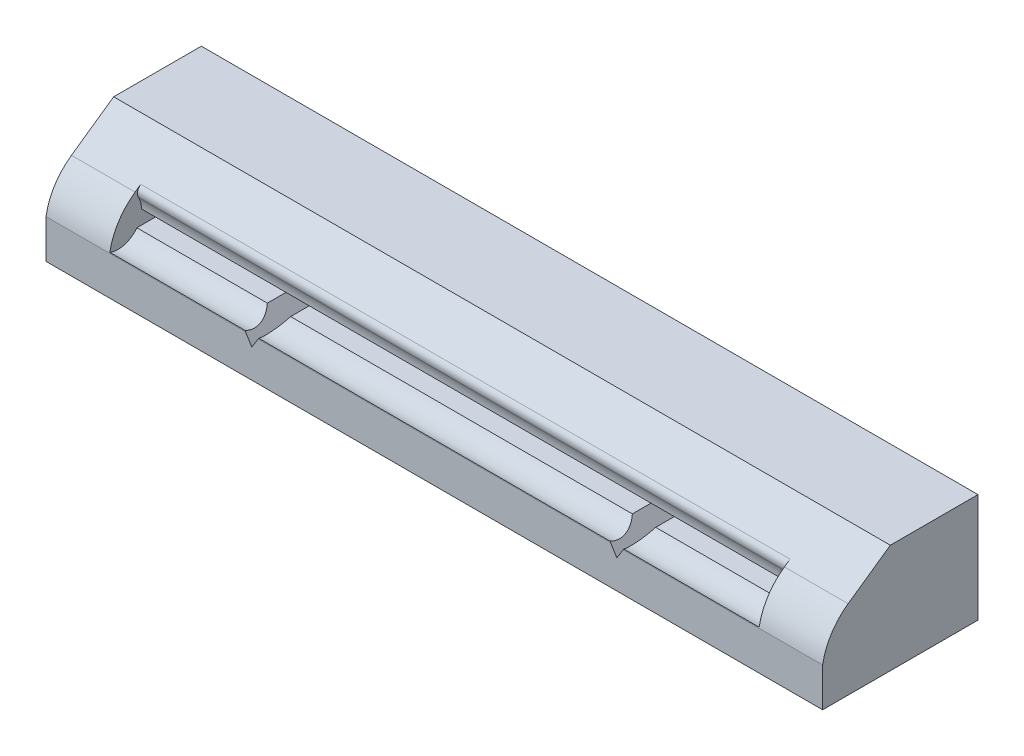
ISO-10303-21;
HEADER;
FILE_DESCRIPTION(('STEP AP214'),'2;1');
FILE_NAME('part.step','',(''),(''),'','','');
FILE_SCHEMA(('AUTOMOTIVE_DESIGN { 1 0 10303 214 1 1 1 1 }'));
ENDSEC;
DATA;
#1=APPLICATION_CONTEXT('core data for automotive mechanical design processes');
#2=APPLICATION_PROTOCOL_DEFINITION('international standard','automotive_design',2000,#1);
#3=PRODUCT_CONTEXT('',#1,'mechanical');
#4=PRODUCT('Part','Part','',(#3));
#5=PRODUCT_RELATED_PRODUCT_CATEGORY('part','',(#4));
#6=PRODUCT_DEFINITION_FORMATION('','',#4);
#7=PRODUCT_DEFINITION_CONTEXT('part definition',#1,'design');
#8=PRODUCT_DEFINITION('design','',#6,#7);
#9=PRODUCT_DEFINITION_SHAPE('','',#8);
#10=(LENGTH_UNIT() NAMED_UNIT(*) SI_UNIT(.MILLI.,.METRE.));
#11=(NAMED_UNIT(*) PLANE_ANGLE_UNIT() SI_UNIT($,.RADIAN.));
#12=(NAMED_UNIT(*) SI_UNIT($,.STERADIAN.) SOLID_ANGLE_UNIT());
#13=UNCERTAINTY_MEASURE_WITH_UNIT(LENGTH_MEASURE(1.E-05),#10,'distance_accuracy_value','');
#14=(GEOMETRIC_REPRESENTATION_CONTEXT(3) GLOBAL_UNCERTAINTY_ASSIGNED_CONTEXT((#13)) GLOBAL_UNIT_ASSIGNED_CONTEXT((#10,
#11,#12)) REPRESENTATION_CONTEXT('',''));
#15=CARTESIAN_POINT('',(0.,0.,0.));
#16=DIRECTION('',(0.,0.,1.));
#17=DIRECTION('',(1.,0.,0.));
#18=AXIS2_PLACEMENT_3D('',#15,#16,#17);
#19=CARTESIAN_POINT('',(-25.,-1.6543103448275,6.08499685629618));
#20=DIRECTION('',(1.,0.,0.));
#21=DIRECTION('',(0.,0.,-1.));
#22=AXIS2_PLACEMENT_3D('',#19,#20,#21);
#23=CYLINDRICAL_SURFACE('',#22,3.96930367225274);
#24=CARTESIAN_POINT('',(-20.9,-1.6543103448275,6.08499685629618));
#25=DIRECTION('',(-1.,0.,0.));
#26=DIRECTION('',(0.,-1.,0.));
#27=AXIS2_PLACEMENT_3D('',#24,#25,#26);
#28=CIRCLE('',#27,3.96930367225274);
#29=CARTESIAN_POINT('',(-20.9,1.59715287270214,8.36169591142201));
#30=VERTEX_POINT('',#29);
#31=CARTESIAN_POINT('',(-20.9,-0.949205843987241,9.9911713641048));
#32=VERTEX_POINT('',#31);
#33=EDGE_CURVE('E49',#30,#32,#28,.F.);
#34=ORIENTED_EDGE('',*,*,#33,.F.);
#35=DIRECTION('',(1.,0.,0.));
#36=VECTOR('',#35,1.);
#37=CARTESIAN_POINT('',(-25.,1.59715287270214,8.36169591142201));
#38=LINE('',#37,#36);
#39=CARTESIAN_POINT('',(-25.,1.59715287270214,8.36169591142201));
#40=VERTEX_POINT('',#39);
#41=EDGE_CURVE('E292',#40,#30,#38,.T.);
#42=ORIENTED_EDGE('',*,*,#41,.F.);
#43=CARTESIAN_POINT('',(-25.,-1.6543103448275,6.08499685629618));
#44=DIRECTION('',(-1.,0.,0.));
#45=DIRECTION('',(0.,0.,1.));
#46=AXIS2_PLACEMENT_3D('',#43,#44,#45);
#47=CIRCLE('',#46,3.96930367225274);
#48=CARTESIAN_POINT('',(-25.,-1.,10.));
#49=VERTEX_POINT('',#48);
#50=EDGE_CURVE('E277',#49,#40,#47,.T.);
#51=ORIENTED_EDGE('',*,*,#50,.F.);
#52=DIRECTION('',(1.,0.,0.));
#53=VECTOR('',#52,1.);
#54=CARTESIAN_POINT('',(-25.,-1.,10.));
#55=LINE('',#54,#53);
#56=CARTESIAN_POINT('',(-12.15625,-1.,10.));
#57=VERTEX_POINT('',#56);
#58=EDGE_CURVE('E284',#49,#57,#55,.T.);
#59=ORIENTED_EDGE('',*,*,#58,.T.);
#60=CARTESIAN_POINT('',(-11.7473060344828,-1.6543103448275,6.08499685629618));
#61=DIRECTION('',(-0.847998304005088,-0.52999894000318,0.));
#62=DIRECTION('',(0.52999894000318,-0.847998304005088,0.));
#63=AXIS2_PLACEMENT_3D('',#60,#61,#62);
#64=ELLIPSE('',#63,4.68079199392942,3.96930367225274);
#65=CARTESIAN_POINT('',(-12.187996347508,-0.949205843987241,9.9911713641048));
#66=VERTEX_POINT('',#65);
#67=EDGE_CURVE('E296',#66,#57,#64,.F.);
#68=ORIENTED_EDGE('',*,*,#67,.F.);
#69=DIRECTION('',(1.,0.,0.));
#70=VECTOR('',#69,1.);
#71=CARTESIAN_POINT('',(0.,-0.949205843987241,9.9911713641048));
#72=LINE('',#71,#70);
#73=EDGE_CURVE('E253',#66,#32,#72,.F.);
#74=ORIENTED_EDGE('',*,*,#73,.T.);
#75=EDGE_LOOP('',(#34,#42,#51,#59,#68,#74));
#76=FACE_BOUND('',#75,.T.);
#77=ADVANCED_FACE('F34',(#76),#23,.T.);
#78=CARTESIAN_POINT('',(-25.,3.5,10.));
#79=DIRECTION('',(1.,0.,0.));
#80=DIRECTION('',(0.,0.,-1.));
#81=AXIS2_PLACEMENT_3D('',#78,#79,#80);
#82=PLANE('',#81);
#83=DIRECTION('',(0.,-1.,0.));
#84=VECTOR('',#83,1.);
#85=CARTESIAN_POINT('',(-25.,3.5,10.));
#86=LINE('',#85,#84);
#87=CARTESIAN_POINT('',(-25.,-3.5,10.));
#88=VERTEX_POINT('',#87);
#89=EDGE_CURVE('E361',#49,#88,#86,.T.);
#90=ORIENTED_EDGE('',*,*,#89,.F.);
#91=ORIENTED_EDGE('',*,*,#50,.T.);
#92=DIRECTION('',(0.,0.573576436351042,-0.819152044288995));
#93=VECTOR('',#92,1.);
#94=CARTESIAN_POINT('',(-25.,3.5,5.64414857943658));
#95=LINE('',#94,#93);
#96=CARTESIAN_POINT('',(-25.,3.5,5.64414857943658));
#97=VERTEX_POINT('',#96);
#98=EDGE_CURVE('E280',#40,#97,#95,.T.);
#99=ORIENTED_EDGE('',*,*,#98,.T.);
#100=DIRECTION('',(0.,0.,-1.));
#101=VECTOR('',#100,1.);
#102=CARTESIAN_POINT('',(-25.,3.5,10.));
#103=LINE('',#102,#101);
#104=CARTESIAN_POINT('',(-25.,3.5,0.));
#105=VERTEX_POINT('',#104);
#106=EDGE_CURVE('E369',#97,#105,#103,.T.);
#107=ORIENTED_EDGE('',*,*,#106,.T.);
#108=DIRECTION('',(0.,-1.,0.));
#109=VECTOR('',#108,1.);
#110=CARTESIAN_POINT('',(-25.,3.5,0.));
#111=LINE('',#110,#109);
#112=CARTESIAN_POINT('',(-25.,-3.5,0.));
#113=VERTEX_POINT('',#112);
#114=EDGE_CURVE('E335',#105,#113,#111,.T.);
#115=ORIENTED_EDGE('',*,*,#114,.T.);
#116=DIRECTION('',(0.,0.,-1.));
#117=VECTOR('',#116,1.);
#118=CARTESIAN_POINT('',(-25.,-3.5,10.));
#119=LINE('',#118,#117);
#120=EDGE_CURVE('E385',#88,#113,#119,.T.);
#121=ORIENTED_EDGE('',*,*,#120,.F.);
#122=EDGE_LOOP('',(#90,#91,#99,#107,#115,#121));
#123=FACE_BOUND('',#122,.T.);
#124=ADVANCED_FACE('F472',(#123),#82,.F.);
#125=CARTESIAN_POINT('',(25.,-3.5,10.));
#126=DIRECTION('',(0.,1.,0.));
#127=DIRECTION('',(0.,0.,1.));
#128=AXIS2_PLACEMENT_3D('',#125,#126,#127);
#129=PLANE('',#128);
#130=DIRECTION('',(1.,0.,0.));
#131=VECTOR('',#130,1.);
#132=CARTESIAN_POINT('',(25.,-3.5,0.));
#133=LINE('',#132,#131);
#134=CARTESIAN_POINT('',(25.,-3.5,0.));
#135=VERTEX_POINT('',#134);
#136=EDGE_CURVE('E372',#113,#135,#133,.T.);
#137=ORIENTED_EDGE('',*,*,#136,.T.);
#138=DIRECTION('',(0.,0.,-1.));
#139=VECTOR('',#138,1.);
#140=CARTESIAN_POINT('',(25.,-3.5,10.));
#141=LINE('',#140,#139);
#142=CARTESIAN_POINT('',(25.,-3.5,10.));
#143=VERTEX_POINT('',#142);
#144=EDGE_CURVE('E382',#143,#135,#141,.T.);
#145=ORIENTED_EDGE('',*,*,#144,.F.);
#146=DIRECTION('',(1.,0.,0.));
#147=VECTOR('',#146,1.);
#148=CARTESIAN_POINT('',(25.,-3.5,10.));
#149=LINE('',#148,#147);
#150=EDGE_CURVE('E363',#88,#143,#149,.T.);
#151=ORIENTED_EDGE('',*,*,#150,.F.);
#152=ORIENTED_EDGE('',*,*,#120,.T.);
#153=EDGE_LOOP('',(#137,#145,#151,#152));
#154=FACE_BOUND('',#153,.T.);
#155=ADVANCED_FACE('F478',(#154),#129,.F.);
#156=CARTESIAN_POINT('',(25.,3.5,10.));
#157=DIRECTION('',(-1.,0.,0.));
#158=DIRECTION('',(0.,0.,1.));
#159=AXIS2_PLACEMENT_3D('',#156,#157,#158);
#160=PLANE('',#159);
#161=DIRECTION('',(0.,0.573576436351042,-0.819152044288995));
#162=VECTOR('',#161,1.);
#163=CARTESIAN_POINT('',(25.,3.5,5.64414857943658));
#164=LINE('',#163,#162);
#165=CARTESIAN_POINT('',(25.,1.59715287270214,8.36169591142201));
#166=VERTEX_POINT('',#165);
#167=CARTESIAN_POINT('',(25.,3.5,5.64414857943658));
#168=VERTEX_POINT('',#167);
#169=EDGE_CURVE('E275',#166,#168,#164,.T.);
#170=ORIENTED_EDGE('',*,*,#169,.F.);
#171=CARTESIAN_POINT('',(25.,-1.6543103448275,6.08499685629618));
#172=DIRECTION('',(-1.,0.,0.));
#173=DIRECTION('',(0.,0.,1.));
#174=AXIS2_PLACEMENT_3D('',#171,#172,#173);
#175=CIRCLE('',#174,3.96930367225274);
#176=CARTESIAN_POINT('',(25.,-1.,10.));
#177=VERTEX_POINT('',#176);
#178=EDGE_CURVE('E272',#177,#166,#175,.T.);
#179=ORIENTED_EDGE('',*,*,#178,.F.);
#180=DIRECTION('',(0.,1.,0.));
#181=VECTOR('',#180,1.);
#182=CARTESIAN_POINT('',(25.,3.5,10.));
#183=LINE('',#182,#181);
#184=EDGE_CURVE('E366',#143,#177,#183,.T.);
#185=ORIENTED_EDGE('',*,*,#184,.F.);
#186=ORIENTED_EDGE('',*,*,#144,.T.);
#187=DIRECTION('',(0.,1.,0.));
#188=VECTOR('',#187,1.);
#189=CARTESIAN_POINT('',(25.,3.5,0.));
#190=LINE('',#189,#188);
#191=CARTESIAN_POINT('',(25.,3.5,0.));
#192=VERTEX_POINT('',#191);
#193=EDGE_CURVE('E374',#135,#192,#190,.T.);
#194=ORIENTED_EDGE('',*,*,#193,.T.);
#195=DIRECTION('',(0.,0.,-1.));
#196=VECTOR('',#195,1.);
#197=CARTESIAN_POINT('',(25.,3.5,10.));
#198=LINE('',#197,#196);
#199=EDGE_CURVE('E380',#168,#192,#198,.T.);
#200=ORIENTED_EDGE('',*,*,#199,.F.);
#201=EDGE_LOOP('',(#170,#179,#185,#186,#194,#200));
#202=FACE_BOUND('',#201,.T.);
#203=ADVANCED_FACE('F482',(#202),#160,.F.);
#204=CARTESIAN_POINT('',(25.,3.5,10.));
#205=DIRECTION('',(0.,-1.,0.));
#206=DIRECTION('',(0.,0.,-1.));
#207=AXIS2_PLACEMENT_3D('',#204,#205,#206);
#208=PLANE('',#207);
#209=ORIENTED_EDGE('',*,*,#106,.F.);
#210=DIRECTION('',(1.,0.,0.));
#211=VECTOR('',#210,1.);
#212=CARTESIAN_POINT('',(-25.,3.5,5.64414857943658));
#213=LINE('',#212,#211);
#214=EDGE_CURVE('E289',#97,#168,#213,.T.);
#215=ORIENTED_EDGE('',*,*,#214,.T.);
#216=ORIENTED_EDGE('',*,*,#199,.T.);
#217=DIRECTION('',(-1.,0.,0.));
#218=VECTOR('',#217,1.);
#219=CARTESIAN_POINT('',(25.,3.5,0.));
#220=LINE('',#219,#218);
#221=EDGE_CURVE('E364',#192,#105,#220,.T.);
#222=ORIENTED_EDGE('',*,*,#221,.T.);
#223=EDGE_LOOP('',(#209,#215,#216,#222));
#224=FACE_BOUND('',#223,.T.);
#225=ADVANCED_FACE('F485',(#224),#208,.F.);
#226=CARTESIAN_POINT('',(0.,0.,10.));
#227=DIRECTION('',(0.,0.,-1.));
#228=DIRECTION('',(-1.,0.,0.));
#229=AXIS2_PLACEMENT_3D('',#226,#227,#228);
#230=PLANE('',#229);
#231=ORIENTED_EDGE('',*,*,#184,.T.);
#232=CARTESIAN_POINT('',(12.15625,-1.,10.));
#233=VERTEX_POINT('',#232);
#234=EDGE_CURVE('E288',#233,#177,#55,.T.);
#235=ORIENTED_EDGE('',*,*,#234,.F.);
#236=DIRECTION('',(0.529998940003177,0.84799830400509,0.));
#237=VECTOR('',#236,1.);
#238=CARTESIAN_POINT('',(12.4999999999999,-0.45000000000002,10.));
#239=LINE('',#238,#237);
#240=CARTESIAN_POINT('',(11.75,-1.64999999999991,10.));
#241=VERTEX_POINT('',#240);
#242=EDGE_CURVE('E324',#241,#233,#239,.T.);
#243=ORIENTED_EDGE('',*,*,#242,.F.);
#244=DIRECTION('',(0.529998940003184,-0.847998304005085,0.));
#245=VECTOR('',#244,1.);
#246=CARTESIAN_POINT('',(11.75,-1.64999999999992,10.));
#247=LINE('',#246,#245);
#248=CARTESIAN_POINT('',(11.34375,-0.999999999999998,10.));
#249=VERTEX_POINT('',#248);
#250=EDGE_CURVE('E322',#249,#241,#247,.T.);
#251=ORIENTED_EDGE('',*,*,#250,.F.);
#252=CARTESIAN_POINT('',(-11.34375,-1.,10.));
#253=VERTEX_POINT('',#252);
#254=EDGE_CURVE('E287',#253,#249,#55,.T.);
#255=ORIENTED_EDGE('',*,*,#254,.F.);
#256=DIRECTION('',(0.529998940003176,0.84799830400509,0.));
#257=VECTOR('',#256,1.);
#258=CARTESIAN_POINT('',(-11.,-0.449999999999992,10.));
#259=LINE('',#258,#257);
#260=CARTESIAN_POINT('',(-11.75,-1.65,10.));
#261=VERTEX_POINT('',#260);
#262=EDGE_CURVE('E308',#261,#253,#259,.T.);
#263=ORIENTED_EDGE('',*,*,#262,.F.);
#264=DIRECTION('',(0.52999894000318,-0.847998304005088,0.));
#265=VECTOR('',#264,1.);
#266=CARTESIAN_POINT('',(-11.75,-1.65,10.));
#267=LINE('',#266,#265);
#268=EDGE_CURVE('E328',#57,#261,#267,.T.);
#269=ORIENTED_EDGE('',*,*,#268,.F.);
#270=ORIENTED_EDGE('',*,*,#58,.F.);
#271=ORIENTED_EDGE('',*,*,#89,.T.);
#272=ORIENTED_EDGE('',*,*,#150,.T.);
#273=EDGE_LOOP('',(#231,#235,#243,#251,#255,#263,#269,#270,#271,#272));
#274=FACE_BOUND('',#273,.T.);
#275=ADVANCED_FACE('F429',(#274),#230,.F.);
#276=CARTESIAN_POINT('',(0.,0.,0.));
#277=DIRECTION('',(0.,0.,-1.));
#278=DIRECTION('',(-1.,0.,0.));
#279=AXIS2_PLACEMENT_3D('',#276,#277,#278);
#280=PLANE('',#279);
#281=ORIENTED_EDGE('',*,*,#114,.F.);
#282=ORIENTED_EDGE('',*,*,#221,.F.);
#283=ORIENTED_EDGE('',*,*,#193,.F.);
#284=ORIENTED_EDGE('',*,*,#136,.F.);
#285=EDGE_LOOP('',(#281,#282,#283,#284));
#286=FACE_BOUND('',#285,.T.);
#287=ADVANCED_FACE('F489',(#286),#280,.T.);
#288=CARTESIAN_POINT('',(11.75,-1.64999999999992,2.5));
#289=DIRECTION('',(-0.847998304005085,-0.529998940003184,0.));
#290=DIRECTION('',(0.529998940003184,-0.847998304005085,0.));
#291=AXIS2_PLACEMENT_3D('',#288,#289,#290);
#292=PLANE('',#291);
#293=DIRECTION('',(0.,0.,1.));
#294=VECTOR('',#293,1.);
#295=CARTESIAN_POINT('',(11.,-0.449999999999923,2.5));
#296=LINE('',#295,#294);
#297=CARTESIAN_POINT('',(11.,-0.449999999999923,5.90276909177077));
#298=VERTEX_POINT('',#297);
#299=CARTESIAN_POINT('',(11.,-0.450000000000036,8.25059481434334));
#300=VERTEX_POINT('',#299);
#301=EDGE_CURVE('E332',#298,#300,#296,.T.);
#302=ORIENTED_EDGE('',*,*,#301,.T.);
#303=CARTESIAN_POINT('',(10.4375000000001,0.449999999999978,9.45059481434333));
#304=DIRECTION('',(-0.847998304005085,-0.529998940003184,0.));
#305=DIRECTION('',(0.529998940003184,-0.847998304005085,0.));
#306=AXIS2_PLACEMENT_3D('',#303,#304,#305);
#307=ELLIPSE('',#306,1.76887146226062,1.5);
#308=CARTESIAN_POINT('',(11.3120036524921,-0.949205843987241,9.9911713641048));
#309=VERTEX_POINT('',#308);
#310=EDGE_CURVE('E250',#300,#309,#307,.T.);
#311=ORIENTED_EDGE('',*,*,#310,.T.);
#312=CARTESIAN_POINT('',(11.7526939655172,-1.6543103448275,6.08499685629618));
#313=DIRECTION('',(-0.847998304005085,-0.529998940003184,0.));
#314=DIRECTION('',(0.529998940003184,-0.847998304005085,0.));
#315=AXIS2_PLACEMENT_3D('',#312,#313,#314);
#316=ELLIPSE('',#315,4.68079199392943,3.96930367225274);
#317=EDGE_CURVE('E301',#309,#249,#316,.F.);
#318=ORIENTED_EDGE('',*,*,#317,.T.);
#319=ORIENTED_EDGE('',*,*,#250,.T.);
#320=DIRECTION('',(0.,0.,1.));
#321=VECTOR('',#320,1.);
#322=CARTESIAN_POINT('',(11.75,-1.64999999999992,2.5));
#323=LINE('',#322,#321);
#324=CARTESIAN_POINT('',(11.75,-1.64999999999992,5.90276909177076));
#325=VERTEX_POINT('',#324);
#326=EDGE_CURVE('E321',#325,#241,#323,.T.);
#327=ORIENTED_EDGE('',*,*,#326,.F.);
#328=DIRECTION('',(-0.529998940003184,0.847998304005085,0.));
#329=VECTOR('',#328,1.);
#330=CARTESIAN_POINT('',(11.75,-1.64999999999992,5.90276909177077));
#331=LINE('',#330,#329);
#332=EDGE_CURVE('E400',#325,#298,#331,.T.);
#333=ORIENTED_EDGE('',*,*,#332,.T.);
#334=EDGE_LOOP('',(#302,#311,#318,#319,#327,#333));
#335=FACE_BOUND('',#334,.T.);
#336=ADVANCED_FACE('F440',(#335),#292,.F.);
#337=CARTESIAN_POINT('',(11.,-0.449999999999923,2.5));
#338=DIRECTION('',(0.,-1.,0.));
#339=DIRECTION('',(1.,0.,0.));
#340=AXIS2_PLACEMENT_3D('',#337,#338,#339);
#341=PLANE('',#340);
#342=DIRECTION('',(0.,0.,1.));
#343=VECTOR('',#342,1.);
#344=CARTESIAN_POINT('',(-11.,-0.449999999999992,2.5));
#345=LINE('',#344,#343);
#346=CARTESIAN_POINT('',(-11.,-0.449999999999992,5.90276909177077));
#347=VERTEX_POINT('',#346);
#348=CARTESIAN_POINT('',(-11.,-0.449999999999992,8.25059481434331));
#349=VERTEX_POINT('',#348);
#350=EDGE_CURVE('E336',#347,#349,#345,.T.);
#351=ORIENTED_EDGE('',*,*,#350,.T.);
#352=DIRECTION('',(1.,0.,0.));
#353=VECTOR('',#352,1.);
#354=CARTESIAN_POINT('',(-24.9888181994135,-0.450000000000036,8.25059481434334));
#355=LINE('',#354,#353);
#356=EDGE_CURVE('E242',#349,#300,#355,.T.);
#357=ORIENTED_EDGE('',*,*,#356,.T.);
#358=ORIENTED_EDGE('',*,*,#301,.F.);
#359=DIRECTION('',(0.203578758668877,0.,-0.979058572823322));
#360=VECTOR('',#359,1.);
#361=CARTESIAN_POINT('',(11.6782247213172,-0.449999999999921,2.64102542043643));
#362=LINE('',#361,#360);
#363=CARTESIAN_POINT('',(11.7075485849043,-0.44999999999992,2.5));
#364=VERTEX_POINT('',#363);
#365=EDGE_CURVE('E408',#298,#364,#362,.T.);
#366=ORIENTED_EDGE('',*,*,#365,.T.);
#367=DIRECTION('',(1.,0.,0.));
#368=VECTOR('',#367,1.);
#369=CARTESIAN_POINT('',(11.,-0.449999999999923,2.5));
#370=LINE('',#369,#368);
#371=CARTESIAN_POINT('',(-11.7075485849042,-0.449999999999994,2.5));
#372=VERTEX_POINT('',#371);
#373=EDGE_CURVE('E319',#372,#364,#370,.T.);
#374=ORIENTED_EDGE('',*,*,#373,.F.);
#375=DIRECTION('',(0.203578758668876,0.,0.979058572823322));
#376=VECTOR('',#375,1.);
#377=CARTESIAN_POINT('',(-10.7664498797317,-0.449999999999991,7.02596705666529));
#378=LINE('',#377,#376);
#379=EDGE_CURVE('E416',#372,#347,#378,.T.);
#380=ORIENTED_EDGE('',*,*,#379,.T.);
#381=EDGE_LOOP('',(#351,#357,#358,#366,#374,#380));
#382=FACE_BOUND('',#381,.T.);
#383=ADVANCED_FACE('F454',(#382),#341,.F.);
#384=CARTESIAN_POINT('',(-11.,-0.449999999999992,2.5));
#385=DIRECTION('',(0.84799830400509,-0.529998940003176,0.));
#386=DIRECTION('',(0.529998940003176,0.84799830400509,0.));
#387=AXIS2_PLACEMENT_3D('',#384,#385,#386);
#388=PLANE('',#387);
#389=CARTESIAN_POINT('',(-11.7526939655172,-1.6543103448275,6.08499685629618));
#390=DIRECTION('',(0.84799830400509,-0.529998940003176,0.));
#391=DIRECTION('',(0.529998940003176,0.84799830400509,0.));
#392=AXIS2_PLACEMENT_3D('',#389,#390,#391);
#393=ELLIPSE('',#392,4.68079199392941,3.96930367225274);
#394=CARTESIAN_POINT('',(-11.312003652492,-0.949205843987241,9.9911713641048));
#395=VERTEX_POINT('',#394);
#396=EDGE_CURVE('E298',#253,#395,#393,.F.);
#397=ORIENTED_EDGE('',*,*,#396,.T.);
#398=CARTESIAN_POINT('',(-10.4375,0.449999999999978,9.45059481434333));
#399=DIRECTION('',(0.84799830400509,-0.529998940003176,0.));
#400=DIRECTION('',(0.529998940003176,0.84799830400509,0.));
#401=AXIS2_PLACEMENT_3D('',#398,#399,#400);
#402=ELLIPSE('',#401,1.76887146226061,1.5);
#403=EDGE_CURVE('E238',#395,#349,#402,.T.);
#404=ORIENTED_EDGE('',*,*,#403,.T.);
#405=ORIENTED_EDGE('',*,*,#350,.F.);
#406=DIRECTION('',(-0.529998940003176,-0.84799830400509,0.));
#407=VECTOR('',#406,1.);
#408=CARTESIAN_POINT('',(-11.,-0.449999999999992,5.90276909177077));
#409=LINE('',#408,#407);
#410=CARTESIAN_POINT('',(-11.75,-1.65,5.90276909177077));
#411=VERTEX_POINT('',#410);
#412=EDGE_CURVE('E406',#347,#411,#409,.T.);
#413=ORIENTED_EDGE('',*,*,#412,.T.);
#414=DIRECTION('',(0.,0.,1.));
#415=VECTOR('',#414,1.);
#416=CARTESIAN_POINT('',(-11.75,-1.65,2.5));
#417=LINE('',#416,#415);
#418=EDGE_CURVE('E339',#411,#261,#417,.T.);
#419=ORIENTED_EDGE('',*,*,#418,.T.);
#420=ORIENTED_EDGE('',*,*,#262,.T.);
#421=EDGE_LOOP('',(#397,#404,#405,#413,#419,#420));
#422=FACE_BOUND('',#421,.T.);
#423=ADVANCED_FACE('F459',(#422),#388,.F.);
#424=CARTESIAN_POINT('',(-11.75,-1.65,2.5));
#425=DIRECTION('',(-0.847998304005088,-0.52999894000318,0.));
#426=DIRECTION('',(0.52999894000318,-0.847998304005088,0.));
#427=AXIS2_PLACEMENT_3D('',#424,#425,#426);
#428=PLANE('',#427);
#429=DIRECTION('',(0.,0.,1.));
#430=VECTOR('',#429,1.);
#431=CARTESIAN_POINT('',(-12.5,-0.449999999999992,2.5));
#432=LINE('',#431,#430);
#433=CARTESIAN_POINT('',(-12.5,-0.449999999999992,5.90276909177077));
#434=VERTEX_POINT('',#433);
#435=CARTESIAN_POINT('',(-12.5,-0.449999999999992,8.25059481434331));
#436=VERTEX_POINT('',#435);
#437=EDGE_CURVE('E342',#434,#436,#432,.T.);
#438=ORIENTED_EDGE('',*,*,#437,.T.);
#439=CARTESIAN_POINT('',(-13.0625,0.449999999999978,9.45059481434333));
#440=DIRECTION('',(-0.847998304005088,-0.52999894000318,0.));
#441=DIRECTION('',(0.52999894000318,-0.847998304005088,0.));
#442=AXIS2_PLACEMENT_3D('',#439,#440,#441);
#443=ELLIPSE('',#442,1.76887146226061,1.5);
#444=EDGE_CURVE('E256',#436,#66,#443,.T.);
#445=ORIENTED_EDGE('',*,*,#444,.T.);
#446=ORIENTED_EDGE('',*,*,#67,.T.);
#447=ORIENTED_EDGE('',*,*,#268,.T.);
#448=ORIENTED_EDGE('',*,*,#418,.F.);
#449=DIRECTION('',(-0.52999894000318,0.847998304005088,0.));
#450=VECTOR('',#449,1.);
#451=CARTESIAN_POINT('',(-11.75,-1.65,5.90276909177077));
#452=LINE('',#451,#450);
#453=EDGE_CURVE('E404',#411,#434,#452,.T.);
#454=ORIENTED_EDGE('',*,*,#453,.T.);
#455=EDGE_LOOP('',(#438,#445,#446,#447,#448,#454));
#456=FACE_BOUND('',#455,.T.);
#457=ADVANCED_FACE('F466',(#456),#428,.F.);
#458=CARTESIAN_POINT('',(-12.5,-0.449999999999992,2.5));
#459=DIRECTION('',(0.,-1.,0.));
#460=DIRECTION('',(1.,0.,0.));
#461=AXIS2_PLACEMENT_3D('',#458,#459,#460);
#462=PLANE('',#461);
#463=DIRECTION('',(0.,0.,1.));
#464=VECTOR('',#463,1.);
#465=CARTESIAN_POINT('',(-20.9,-0.45000000000002,2.5));
#466=LINE('',#465,#464);
#467=CARTESIAN_POINT('',(-20.9,-0.45000000000002,2.5));
#468=VERTEX_POINT('',#467);
#469=CARTESIAN_POINT('',(-20.9,-0.45000000000002,8.25059481434333));
#470=VERTEX_POINT('',#469);
#471=EDGE_CURVE('E345',#468,#470,#466,.T.);
#472=ORIENTED_EDGE('',*,*,#471,.T.);
#473=DIRECTION('',(1.,0.,0.));
#474=VECTOR('',#473,1.);
#475=CARTESIAN_POINT('',(-24.9888181994135,-0.450000000000033,8.25059481434334));
#476=LINE('',#475,#474);
#477=EDGE_CURVE('E260',#470,#436,#476,.T.);
#478=ORIENTED_EDGE('',*,*,#477,.T.);
#479=ORIENTED_EDGE('',*,*,#437,.F.);
#480=DIRECTION('',(0.203578758668877,0.,-0.979058572823322));
#481=VECTOR('',#480,1.);
#482=CARTESIAN_POINT('',(-11.8217752786828,-0.44999999999999,2.64102542043643));
#483=LINE('',#482,#481);
#484=CARTESIAN_POINT('',(-11.7924514150958,-0.44999999999999,2.5));
#485=VERTEX_POINT('',#484);
#486=EDGE_CURVE('E413',#434,#485,#483,.T.);
#487=ORIENTED_EDGE('',*,*,#486,.T.);
#488=DIRECTION('',(1.,0.,0.));
#489=VECTOR('',#488,1.);
#490=CARTESIAN_POINT('',(-12.5,-0.449999999999992,2.5));
#491=LINE('',#490,#489);
#492=EDGE_CURVE('E317',#468,#485,#491,.T.);
#493=ORIENTED_EDGE('',*,*,#492,.F.);
#494=EDGE_LOOP('',(#472,#478,#479,#487,#493));
#495=FACE_BOUND('',#494,.T.);
#496=ADVANCED_FACE('F585',(#495),#462,.F.);
#497=CARTESIAN_POINT('',(-20.9,-0.45000000000002,2.5));
#498=DIRECTION('',(-1.,0.,0.));
#499=DIRECTION('',(0.,-1.,0.));
#500=AXIS2_PLACEMENT_3D('',#497,#498,#499);
#501=PLANE('',#500);
#502=DIRECTION('',(0.,0.,1.));
#503=VECTOR('',#502,1.);
#504=CARTESIAN_POINT('',(-20.9,0.449999999999992,2.5));
#505=LINE('',#504,#503);
#506=CARTESIAN_POINT('',(-20.9,0.449999999999992,2.5));
#507=VERTEX_POINT('',#506);
#508=CARTESIAN_POINT('',(-20.9,0.449999999999979,7.95059481434333));
#509=VERTEX_POINT('',#508);
#510=EDGE_CURVE('E348',#507,#509,#505,.T.);
#511=ORIENTED_EDGE('',*,*,#510,.T.);
#512=CARTESIAN_POINT('',(-20.9,0.449999999999978,9.45059481434333));
#513=DIRECTION('',(-1.,0.,0.));
#514=DIRECTION('',(0.,-1.,0.));
#515=AXIS2_PLACEMENT_3D('',#512,#513,#514);
#516=CIRCLE('',#515,1.5);
#517=CARTESIAN_POINT('',(-20.9,1.19310101109301,8.14759792742743));
#518=VERTEX_POINT('',#517);
#519=EDGE_CURVE('E742',#509,#518,#516,.F.);
#520=ORIENTED_EDGE('',*,*,#519,.T.);
#521=CARTESIAN_POINT('',(-20.9,1.44080134812402,7.7132656317888));
#522=DIRECTION('',(-1.,0.,0.));
#523=DIRECTION('',(0.,-1.,0.));
#524=AXIS2_PLACEMENT_3D('',#521,#522,#523);
#525=CIRCLE('',#524,0.500000000000001);
#526=CARTESIAN_POINT('',(-20.9,1.85037737026851,8.00005384996432));
#527=VERTEX_POINT('',#526);
#528=EDGE_CURVE('E239',#518,#527,#525,.T.);
#529=ORIENTED_EDGE('',*,*,#528,.T.);
#530=DIRECTION('',(0.,-0.573576436351042,0.819152044288995));
#531=VECTOR('',#530,1.);
#532=CARTESIAN_POINT('',(-20.9,1.85037737026852,8.00005384996431));
#533=LINE('',#532,#531);
#534=EDGE_CURVE('E223',#527,#30,#533,.T.);
#535=ORIENTED_EDGE('',*,*,#534,.T.);
#536=ORIENTED_EDGE('',*,*,#33,.T.);
#537=EDGE_CURVE('E741',#32,#470,#516,.F.);
#538=ORIENTED_EDGE('',*,*,#537,.T.);
#539=ORIENTED_EDGE('',*,*,#471,.F.);
#540=DIRECTION('',(0.,-1.,0.));
#541=VECTOR('',#540,1.);
#542=CARTESIAN_POINT('',(-20.9,-0.45000000000002,2.5));
#543=LINE('',#542,#541);
#544=EDGE_CURVE('E314',#507,#468,#543,.T.);
#545=ORIENTED_EDGE('',*,*,#544,.F.);
#546=EDGE_LOOP('',(#511,#520,#529,#535,#536,#538,#539,#545));
#547=FACE_BOUND('',#546,.T.);
#548=ADVANCED_FACE('F579',(#547),#501,.F.);
#549=CARTESIAN_POINT('',(20.9,0.450000000000131,2.5));
#550=DIRECTION('',(0.,1.,0.));
#551=DIRECTION('',(-1.,0.,0.));
#552=AXIS2_PLACEMENT_3D('',#549,#550,#551);
#553=PLANE('',#552);
#554=DIRECTION('',(0.,0.,1.));
#555=VECTOR('',#554,1.);
#556=CARTESIAN_POINT('',(20.9,0.450000000000131,2.5));
#557=LINE('',#556,#555);
#558=CARTESIAN_POINT('',(20.9,0.450000000000131,2.5));
#559=VERTEX_POINT('',#558);
#560=CARTESIAN_POINT('',(20.9,0.450000000000131,7.95059481434333));
#561=VERTEX_POINT('',#560);
#562=EDGE_CURVE('E351',#559,#561,#557,.T.);
#563=ORIENTED_EDGE('',*,*,#562,.T.);
#564=DIRECTION('',(1.,0.,0.));
#565=VECTOR('',#564,1.);
#566=CARTESIAN_POINT('',(-24.9888181994135,0.449999999999979,7.95059481434333));
#567=LINE('',#566,#565);
#568=EDGE_CURVE('E269',#561,#509,#567,.F.);
#569=ORIENTED_EDGE('',*,*,#568,.T.);
#570=ORIENTED_EDGE('',*,*,#510,.F.);
#571=DIRECTION('',(-1.,0.,0.));
#572=VECTOR('',#571,1.);
#573=CARTESIAN_POINT('',(20.9,0.450000000000131,2.5));
#574=LINE('',#573,#572);
#575=EDGE_CURVE('E311',#559,#507,#574,.T.);
#576=ORIENTED_EDGE('',*,*,#575,.F.);
#577=EDGE_LOOP('',(#563,#569,#570,#576));
#578=FACE_BOUND('',#577,.T.);
#579=ADVANCED_FACE('F570',(#578),#553,.F.);
#580=CARTESIAN_POINT('',(20.9,-0.449999999999881,2.5));
#581=DIRECTION('',(1.,0.,0.));
#582=DIRECTION('',(0.,1.,0.));
#583=AXIS2_PLACEMENT_3D('',#580,#581,#582);
#584=PLANE('',#583);
#585=DIRECTION('',(0.,0.,1.));
#586=VECTOR('',#585,1.);
#587=CARTESIAN_POINT('',(20.9,-0.449999999999881,2.5));
#588=LINE('',#587,#586);
#589=CARTESIAN_POINT('',(20.9,-0.449999999999881,2.5));
#590=VERTEX_POINT('',#589);
#591=CARTESIAN_POINT('',(20.9,-0.449999999999881,8.25059481434322));
#592=VERTEX_POINT('',#591);
#593=EDGE_CURVE('E354',#590,#592,#588,.T.);
#594=ORIENTED_EDGE('',*,*,#593,.T.);
#595=CARTESIAN_POINT('',(20.9,0.449999999999978,9.45059481434333));
#596=DIRECTION('',(1.,0.,0.));
#597=DIRECTION('',(0.,1.,0.));
#598=AXIS2_PLACEMENT_3D('',#595,#596,#597);
#599=CIRCLE('',#598,1.5);
#600=CARTESIAN_POINT('',(20.9,-0.949205843987241,9.9911713641048));
#601=VERTEX_POINT('',#600);
#602=EDGE_CURVE('E234',#601,#592,#599,.T.);
#603=ORIENTED_EDGE('',*,*,#602,.F.);
#604=CARTESIAN_POINT('',(20.9,-1.6543103448275,6.08499685629618));
#605=DIRECTION('',(1.,0.,0.));
#606=DIRECTION('',(0.,1.,0.));
#607=AXIS2_PLACEMENT_3D('',#604,#605,#606);
#608=CIRCLE('',#607,3.96930367225274);
#609=CARTESIAN_POINT('',(20.9,1.59715287270214,8.36169591142201));
#610=VERTEX_POINT('',#609);
#611=EDGE_CURVE('E57',#601,#610,#608,.F.);
#612=ORIENTED_EDGE('',*,*,#611,.T.);
#613=DIRECTION('',(0.,-0.573576436351042,0.819152044288995));
#614=VECTOR('',#613,1.);
#615=CARTESIAN_POINT('',(20.9,1.85037737026851,8.00005384996433));
#616=LINE('',#615,#614);
#617=CARTESIAN_POINT('',(20.9,1.85037737026851,8.00005384996432));
#618=VERTEX_POINT('',#617);
#619=EDGE_CURVE('E215',#618,#610,#616,.T.);
#620=ORIENTED_EDGE('',*,*,#619,.F.);
#621=CARTESIAN_POINT('',(20.9,1.44080134812402,7.7132656317888));
#622=DIRECTION('',(1.,0.,0.));
#623=DIRECTION('',(0.,1.,0.));
#624=AXIS2_PLACEMENT_3D('',#621,#622,#623);
#625=CIRCLE('',#624,0.500000000000001);
#626=CARTESIAN_POINT('',(20.9,1.19310101109301,8.14759792742743));
#627=VERTEX_POINT('',#626);
#628=EDGE_CURVE('E220',#627,#618,#625,.F.);
#629=ORIENTED_EDGE('',*,*,#628,.F.);
#630=EDGE_CURVE('E745',#561,#627,#599,.T.);
#631=ORIENTED_EDGE('',*,*,#630,.F.);
#632=ORIENTED_EDGE('',*,*,#562,.F.);
#633=DIRECTION('',(0.,1.,0.));
#634=VECTOR('',#633,1.);
#635=CARTESIAN_POINT('',(20.9,-0.449999999999881,2.5));
#636=LINE('',#635,#634);
#637=EDGE_CURVE('E307',#590,#559,#636,.T.);
#638=ORIENTED_EDGE('',*,*,#637,.F.);
#639=EDGE_LOOP('',(#594,#603,#612,#620,#629,#631,#632,#638));
#640=FACE_BOUND('',#639,.T.);
#641=ADVANCED_FACE('F218',(#640),#584,.F.);
#642=CARTESIAN_POINT('',(20.9,-0.449999999999881,2.5));
#643=DIRECTION('',(0.,-1.,0.));
#644=DIRECTION('',(1.,0.,0.));
#645=AXIS2_PLACEMENT_3D('',#642,#643,#644);
#646=PLANE('',#645);
#647=DIRECTION('',(0.,0.,1.));
#648=VECTOR('',#647,1.);
#649=CARTESIAN_POINT('',(12.4999999999999,-0.45000000000002,2.5));
#650=LINE('',#649,#648);
#651=CARTESIAN_POINT('',(12.4999999999999,-0.45000000000002,5.90276909177076));
#652=VERTEX_POINT('',#651);
#653=CARTESIAN_POINT('',(12.4999999999999,-0.45000000000002,8.25059481434333));
#654=VERTEX_POINT('',#653);
#655=EDGE_CURVE('E356',#652,#654,#650,.T.);
#656=ORIENTED_EDGE('',*,*,#655,.T.);
#657=DIRECTION('',(1.,0.,0.));
#658=VECTOR('',#657,1.);
#659=CARTESIAN_POINT('',(-24.9888181994135,-0.450000000000639,8.25059481434379));
#660=LINE('',#659,#658);
#661=EDGE_CURVE('E266',#654,#592,#660,.T.);
#662=ORIENTED_EDGE('',*,*,#661,.T.);
#663=ORIENTED_EDGE('',*,*,#593,.F.);
#664=DIRECTION('',(1.,0.,0.));
#665=VECTOR('',#664,1.);
#666=CARTESIAN_POINT('',(20.9,-0.449999999999881,2.5));
#667=LINE('',#666,#665);
#668=CARTESIAN_POINT('',(11.7924514150957,-0.450000000000032,2.5));
#669=VERTEX_POINT('',#668);
#670=EDGE_CURVE('E304',#669,#590,#667,.T.);
#671=ORIENTED_EDGE('',*,*,#670,.F.);
#672=DIRECTION('',(0.203578758668879,0.,0.979058572823321));
#673=VECTOR('',#672,1.);
#674=CARTESIAN_POINT('',(12.1699074909245,-0.450000000000025,4.31527586336022));
#675=LINE('',#674,#673);
#676=EDGE_CURVE('E411',#669,#652,#675,.T.);
#677=ORIENTED_EDGE('',*,*,#676,.T.);
#678=EDGE_LOOP('',(#656,#662,#663,#671,#677));
#679=FACE_BOUND('',#678,.T.);
#680=ADVANCED_FACE('F569',(#679),#646,.F.);
#681=CARTESIAN_POINT('',(12.4999999999999,-0.45000000000002,2.5));
#682=DIRECTION('',(0.84799830400509,-0.529998940003177,0.));
#683=DIRECTION('',(0.529998940003177,0.84799830400509,0.));
#684=AXIS2_PLACEMENT_3D('',#681,#682,#683);
#685=PLANE('',#684);
#686=CARTESIAN_POINT('',(11.7473060344828,-1.6543103448275,6.08499685629618));
#687=DIRECTION('',(0.84799830400509,-0.529998940003177,0.));
#688=DIRECTION('',(0.529998940003177,0.84799830400509,0.));
#689=AXIS2_PLACEMENT_3D('',#686,#687,#688);
#690=ELLIPSE('',#689,4.68079199392941,3.96930367225274);
#691=CARTESIAN_POINT('',(12.1879963475079,-0.949205843987241,9.9911713641048));
#692=VERTEX_POINT('',#691);
#693=EDGE_CURVE('E42',#233,#692,#690,.F.);
#694=ORIENTED_EDGE('',*,*,#693,.T.);
#695=CARTESIAN_POINT('',(13.0624999999999,0.449999999999978,9.45059481434333));
#696=DIRECTION('',(0.84799830400509,-0.529998940003177,0.));
#697=DIRECTION('',(0.529998940003177,0.84799830400509,0.));
#698=AXIS2_PLACEMENT_3D('',#695,#696,#697);
#699=ELLIPSE('',#698,1.76887146226061,1.5);
#700=EDGE_CURVE('E263',#692,#654,#699,.T.);
#701=ORIENTED_EDGE('',*,*,#700,.T.);
#702=ORIENTED_EDGE('',*,*,#655,.F.);
#703=DIRECTION('',(-0.529998940003177,-0.84799830400509,0.));
#704=VECTOR('',#703,1.);
#705=CARTESIAN_POINT('',(12.4999999999999,-0.45000000000002,5.90276909177076));
#706=LINE('',#705,#704);
#707=EDGE_CURVE('E402',#652,#325,#706,.T.);
#708=ORIENTED_EDGE('',*,*,#707,.T.);
#709=ORIENTED_EDGE('',*,*,#326,.T.);
#710=ORIENTED_EDGE('',*,*,#242,.T.);
#711=EDGE_LOOP('',(#694,#701,#702,#708,#709,#710));
#712=FACE_BOUND('',#711,.T.);
#713=ADVANCED_FACE('F421',(#712),#685,.F.);
#714=CARTESIAN_POINT('',(0.,0.,2.5));
#715=DIRECTION('',(0.,0.,1.));
#716=DIRECTION('',(1.,0.,0.));
#717=AXIS2_PLACEMENT_3D('',#714,#715,#716);
#718=PLANE('',#717);
#719=ORIENTED_EDGE('',*,*,#373,.T.);
#720=DIRECTION('',(0.529998940003184,-0.847998304005085,0.));
#721=VECTOR('',#720,1.);
#722=CARTESIAN_POINT('',(8.21666415094236,5.13541509433904,2.5));
#723=LINE('',#722,#721);
#724=CARTESIAN_POINT('',(11.75,-0.517922264153117,2.5));
#725=VERTEX_POINT('',#724);
#726=EDGE_CURVE('E397',#364,#725,#723,.T.);
#727=ORIENTED_EDGE('',*,*,#726,.T.);
#728=DIRECTION('',(0.529998940003177,0.84799830400509,0.));
#729=VECTOR('',#728,1.);
#730=CARTESIAN_POINT('',(8.68221225355199,-5.42638265846996,2.5));
#731=LINE('',#730,#729);
#732=EDGE_CURVE('E394',#725,#669,#731,.T.);
#733=ORIENTED_EDGE('',*,*,#732,.T.);
#734=ORIENTED_EDGE('',*,*,#670,.T.);
#735=ORIENTED_EDGE('',*,*,#637,.T.);
#736=ORIENTED_EDGE('',*,*,#575,.T.);
#737=ORIENTED_EDGE('',*,*,#544,.T.);
#738=ORIENTED_EDGE('',*,*,#492,.T.);
#739=DIRECTION('',(0.52999894000318,-0.847998304005088,0.));
#740=VECTOR('',#739,1.);
#741=CARTESIAN_POINT('',(-8.682212253552,-5.42638265847,2.5));
#742=LINE('',#741,#740);
#743=CARTESIAN_POINT('',(-11.75,-0.517922264153196,2.5));
#744=VERTEX_POINT('',#743);
#745=EDGE_CURVE('E391',#485,#744,#742,.T.);
#746=ORIENTED_EDGE('',*,*,#745,.T.);
#747=DIRECTION('',(0.529998940003176,0.84799830400509,0.));
#748=VECTOR('',#747,1.);
#749=CARTESIAN_POINT('',(-8.21666415094243,5.13541509433897,2.5));
#750=LINE('',#749,#748);
#751=EDGE_CURVE('E388',#744,#372,#750,.T.);
#752=ORIENTED_EDGE('',*,*,#751,.T.);
#753=EDGE_LOOP('',(#719,#727,#733,#734,#735,#736,#737,#738,#746,#752));
#754=FACE_BOUND('',#753,.T.);
#755=ADVANCED_FACE('F635',(#754),#718,.T.);
#756=CARTESIAN_POINT('',(8.68221225355199,-5.42638265846996,2.5));
#757=DIRECTION('',(0.835115304325416,-0.521947065203382,-0.173648177666925));
#758=DIRECTION('',(0.529998940003177,0.84799830400509,0.));
#759=AXIS2_PLACEMENT_3D('',#756,#757,#758);
#760=PLANE('',#759);
#761=ORIENTED_EDGE('',*,*,#676,.F.);
#762=ORIENTED_EDGE('',*,*,#732,.F.);
#763=DIRECTION('',(0.,-0.315680952238812,0.948865394243882));
#764=VECTOR('',#763,1.);
#765=CARTESIAN_POINT('',(11.75,0.0454580378934592,0.80660650058398));
#766=LINE('',#765,#764);
#767=EDGE_CURVE('E325',#325,#725,#766,.F.);
#768=ORIENTED_EDGE('',*,*,#767,.F.);
#769=ORIENTED_EDGE('',*,*,#707,.F.);
#770=EDGE_LOOP('',(#761,#762,#768,#769));
#771=FACE_BOUND('',#770,.T.);
#772=ADVANCED_FACE('F446',(#771),#760,.F.);
#773=CARTESIAN_POINT('',(8.21666415094236,5.13541509433903,2.5));
#774=DIRECTION('',(-0.835115304325412,-0.521947065203389,-0.173648177666924));
#775=DIRECTION('',(0.529998940003184,-0.847998304005085,0.));
#776=AXIS2_PLACEMENT_3D('',#773,#774,#775);
#777=PLANE('',#776);
#778=ORIENTED_EDGE('',*,*,#365,.F.);
#779=ORIENTED_EDGE('',*,*,#332,.F.);
#780=ORIENTED_EDGE('',*,*,#767,.T.);
#781=ORIENTED_EDGE('',*,*,#726,.F.);
#782=EDGE_LOOP('',(#778,#779,#780,#781));
#783=FACE_BOUND('',#782,.T.);
#784=ADVANCED_FACE('F451',(#783),#777,.F.);
#785=CARTESIAN_POINT('',(-8.21666415094243,5.13541509433897,2.5));
#786=DIRECTION('',(0.835115304325417,-0.521947065203381,-0.173648177666924));
#787=DIRECTION('',(0.529998940003176,0.84799830400509,0.));
#788=AXIS2_PLACEMENT_3D('',#785,#786,#787);
#789=PLANE('',#788);
#790=ORIENTED_EDGE('',*,*,#379,.F.);
#791=ORIENTED_EDGE('',*,*,#751,.F.);
#792=DIRECTION('',(0.,-0.315680952238813,0.948865394243881));
#793=VECTOR('',#792,1.);
#794=CARTESIAN_POINT('',(-11.75,-1.00707225188211,3.9702739986658));
#795=LINE('',#794,#793);
#796=EDGE_CURVE('E303',#411,#744,#795,.F.);
#797=ORIENTED_EDGE('',*,*,#796,.F.);
#798=ORIENTED_EDGE('',*,*,#412,.F.);
#799=EDGE_LOOP('',(#790,#791,#797,#798));
#800=FACE_BOUND('',#799,.T.);
#801=ADVANCED_FACE('F36',(#800),#789,.F.);
#802=CARTESIAN_POINT('',(-8.682212253552,-5.42638265847,2.5));
#803=DIRECTION('',(-0.835115304325415,-0.521947065203384,-0.173648177666924));
#804=DIRECTION('',(0.52999894000318,-0.847998304005088,0.));
#805=AXIS2_PLACEMENT_3D('',#802,#803,#804);
#806=PLANE('',#805);
#807=ORIENTED_EDGE('',*,*,#486,.F.);
#808=ORIENTED_EDGE('',*,*,#453,.F.);
#809=ORIENTED_EDGE('',*,*,#796,.T.);
#810=ORIENTED_EDGE('',*,*,#745,.F.);
#811=EDGE_LOOP('',(#807,#808,#809,#810));
#812=FACE_BOUND('',#811,.T.);
#813=ADVANCED_FACE('F512',(#812),#806,.F.);
#814=EDGE_CURVE('E283',#610,#166,#38,.T.);
#815=ORIENTED_EDGE('',*,*,#814,.F.);
#816=ORIENTED_EDGE('',*,*,#611,.F.);
#817=EDGE_CURVE('E257',#601,#692,#72,.F.);
#818=ORIENTED_EDGE('',*,*,#817,.T.);
#819=ORIENTED_EDGE('',*,*,#693,.F.);
#820=ORIENTED_EDGE('',*,*,#234,.T.);
#821=ORIENTED_EDGE('',*,*,#178,.T.);
#822=EDGE_LOOP('',(#815,#816,#818,#819,#820,#821));
#823=FACE_BOUND('',#822,.T.);
#824=ADVANCED_FACE('F425',(#823),#23,.T.);
#825=CARTESIAN_POINT('',(-25.,3.5,5.64414857943658));
#826=DIRECTION('',(0.,-0.819152044288995,-0.573576436351042));
#827=DIRECTION('',(0.,0.573576436351042,-0.819152044288995));
#828=AXIS2_PLACEMENT_3D('',#825,#826,#827);
#829=PLANE('',#828);
#830=ORIENTED_EDGE('',*,*,#41,.T.);
#831=ORIENTED_EDGE('',*,*,#534,.F.);
#832=DIRECTION('',(1.,0.,0.));
#833=VECTOR('',#832,1.);
#834=CARTESIAN_POINT('',(-24.9888181994135,1.85037737026851,8.00005384996432));
#835=LINE('',#834,#833);
#836=EDGE_CURVE('E230',#527,#618,#835,.T.);
#837=ORIENTED_EDGE('',*,*,#836,.T.);
#838=ORIENTED_EDGE('',*,*,#619,.T.);
#839=ORIENTED_EDGE('',*,*,#814,.T.);
#840=ORIENTED_EDGE('',*,*,#169,.T.);
#841=ORIENTED_EDGE('',*,*,#214,.F.);
#842=ORIENTED_EDGE('',*,*,#98,.F.);
#843=EDGE_LOOP('',(#830,#831,#837,#838,#839,#840,#841,#842));
#844=FACE_BOUND('',#843,.T.);
#845=ADVANCED_FACE('F237',(#844),#829,.F.);
#846=ORIENTED_EDGE('',*,*,#317,.F.);
#847=DIRECTION('',(1.,0.,0.));
#848=VECTOR('',#847,1.);
#849=CARTESIAN_POINT('',(0.,-0.949205843987241,9.9911713641048));
#850=LINE('',#849,#848);
#851=EDGE_CURVE('E11',#309,#395,#850,.F.);
#852=ORIENTED_EDGE('',*,*,#851,.T.);
#853=ORIENTED_EDGE('',*,*,#396,.F.);
#854=ORIENTED_EDGE('',*,*,#254,.T.);
#855=EDGE_LOOP('',(#846,#852,#853,#854));
#856=FACE_BOUND('',#855,.T.);
#857=ADVANCED_FACE('F436',(#856),#23,.T.);
#858=CARTESIAN_POINT('',(-24.9888181994135,0.449999999999978,9.45059481434333));
#859=DIRECTION('',(1.,0.,0.));
#860=DIRECTION('',(0.,0.,-1.));
#861=AXIS2_PLACEMENT_3D('',#858,#859,#860);
#862=CYLINDRICAL_SURFACE('',#861,1.5);
#863=ORIENTED_EDGE('',*,*,#356,.F.);
#864=ORIENTED_EDGE('',*,*,#403,.F.);
#865=ORIENTED_EDGE('',*,*,#851,.F.);
#866=ORIENTED_EDGE('',*,*,#310,.F.);
#867=EDGE_LOOP('',(#863,#864,#865,#866));
#868=FACE_BOUND('',#867,.T.);
#869=ADVANCED_FACE('F457',(#868),#862,.F.);
#870=CARTESIAN_POINT('',(-24.9888181994135,1.44080134812402,7.7132656317888));
#871=DIRECTION('',(1.,0.,0.));
#872=DIRECTION('',(0.,0.,-1.));
#873=AXIS2_PLACEMENT_3D('',#870,#871,#872);
#874=CYLINDRICAL_SURFACE('',#873,0.500000000000001);
#875=DIRECTION('',(1.,0.,0.));
#876=VECTOR('',#875,1.);
#877=CARTESIAN_POINT('',(-24.9888181994135,1.19310101109301,8.14759792742743));
#878=LINE('',#877,#876);
#879=EDGE_CURVE('E233',#518,#627,#878,.T.);
#880=ORIENTED_EDGE('',*,*,#879,.T.);
#881=ORIENTED_EDGE('',*,*,#628,.T.);
#882=ORIENTED_EDGE('',*,*,#836,.F.);
#883=ORIENTED_EDGE('',*,*,#528,.F.);
#884=EDGE_LOOP('',(#880,#881,#882,#883));
#885=FACE_BOUND('',#884,.T.);
#886=ADVANCED_FACE('F228',(#885),#874,.T.);
#887=ORIENTED_EDGE('',*,*,#630,.T.);
#888=ORIENTED_EDGE('',*,*,#879,.F.);
#889=ORIENTED_EDGE('',*,*,#519,.F.);
#890=ORIENTED_EDGE('',*,*,#568,.F.);
#891=EDGE_LOOP('',(#887,#888,#889,#890));
#892=FACE_BOUND('',#891,.T.);
#893=ADVANCED_FACE('F519',(#892),#862,.F.);
#894=ORIENTED_EDGE('',*,*,#700,.F.);
#895=ORIENTED_EDGE('',*,*,#817,.F.);
#896=ORIENTED_EDGE('',*,*,#602,.T.);
#897=ORIENTED_EDGE('',*,*,#661,.F.);
#898=EDGE_LOOP('',(#894,#895,#896,#897));
#899=FACE_BOUND('',#898,.T.);
#900=ADVANCED_FACE('F525',(#899),#862,.F.);
#901=ORIENTED_EDGE('',*,*,#537,.F.);
#902=ORIENTED_EDGE('',*,*,#73,.F.);
#903=ORIENTED_EDGE('',*,*,#444,.F.);
#904=ORIENTED_EDGE('',*,*,#477,.F.);
#905=EDGE_LOOP('',(#901,#902,#903,#904));
#906=FACE_BOUND('',#905,.T.);
#907=ADVANCED_FACE('F520',(#906),#862,.F.);
#908=CLOSED_SHELL('',(#77,#124,#155,#203,#225,#275,#287,#336,#383,#423,#457,#496,#548,#579,#641,
#680,#713,#755,#772,#784,#801,#813,#824,#845,#857,#869,#886,#893,#900,#907));
#909=MANIFOLD_SOLID_BREP('B2',#908);
#910=ADVANCED_BREP_SHAPE_REPRESENTATION('',(#18,#909),#14);
#911=SHAPE_DEFINITION_REPRESENTATION(#9,#910);
ENDSEC;
END-ISO-10303-21;
